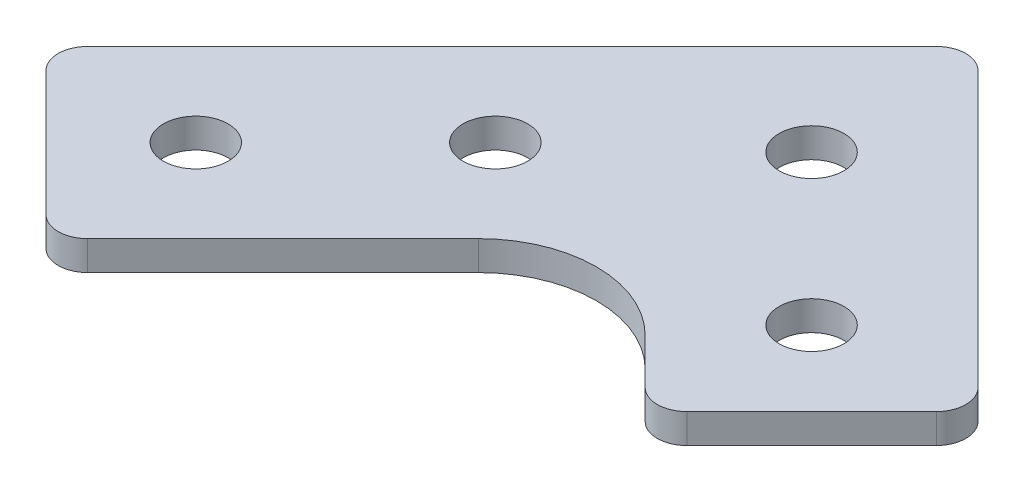
ISO-10303-21;
HEADER;
FILE_DESCRIPTION(('STEP AP214'),'2;1');
FILE_NAME('part.step','',(''),(''),'','','');
FILE_SCHEMA(('AUTOMOTIVE_DESIGN { 1 0 10303 214 1 1 1 1 }'));
ENDSEC;
DATA;
#1=APPLICATION_CONTEXT('core data for automotive mechanical design processes');
#2=APPLICATION_PROTOCOL_DEFINITION('international standard','automotive_design',2000,#1);
#3=PRODUCT_CONTEXT('',#1,'mechanical');
#4=PRODUCT('Part','Part','',(#3));
#5=PRODUCT_RELATED_PRODUCT_CATEGORY('part','',(#4));
#6=PRODUCT_DEFINITION_FORMATION('','',#4);
#7=PRODUCT_DEFINITION_CONTEXT('part definition',#1,'design');
#8=PRODUCT_DEFINITION('design','',#6,#7);
#9=PRODUCT_DEFINITION_SHAPE('','',#8);
#10=(LENGTH_UNIT() NAMED_UNIT(*) SI_UNIT(.MILLI.,.METRE.));
#11=(NAMED_UNIT(*) PLANE_ANGLE_UNIT() SI_UNIT($,.RADIAN.));
#12=(NAMED_UNIT(*) SI_UNIT($,.STERADIAN.) SOLID_ANGLE_UNIT());
#13=UNCERTAINTY_MEASURE_WITH_UNIT(LENGTH_MEASURE(1.E-05),#10,'distance_accuracy_value','');
#14=(GEOMETRIC_REPRESENTATION_CONTEXT(3) GLOBAL_UNCERTAINTY_ASSIGNED_CONTEXT((#13)) GLOBAL_UNIT_ASSIGNED_CONTEXT((#10,
#11,#12)) REPRESENTATION_CONTEXT('',''));
#15=CARTESIAN_POINT('',(0.,0.,0.));
#16=DIRECTION('',(0.,0.,1.));
#17=DIRECTION('',(1.,0.,0.));
#18=AXIS2_PLACEMENT_3D('',#15,#16,#17);
#19=CARTESIAN_POINT('',(32.3289220358488,3.175,32.3289220358491));
#20=DIRECTION('',(-0.70710678118655,0.,0.707106781186545));
#21=DIRECTION('',(0.707106781186545,0.,0.70710678118655));
#22=AXIS2_PLACEMENT_3D('',#19,#20,#21);
#23=PLANE('',#22);
#24=DIRECTION('',(-0.707106781186545,0.,-0.70710678118655));
#25=VECTOR('',#24,1.);
#26=CARTESIAN_POINT('',(32.3289220358488,0.,32.3289220358491));
#27=LINE('',#26,#25);
#28=CARTESIAN_POINT('',(13.9193969876571,0.,13.9193969876572));
#29=VERTEX_POINT('',#28);
#30=CARTESIAN_POINT('',(8.98025612106916,0.,8.98025612106923));
#31=VERTEX_POINT('',#30);
#32=EDGE_CURVE('E137',#29,#31,#27,.T.);
#33=ORIENTED_EDGE('',*,*,#32,.F.);
#34=DIRECTION('',(0.,1.,0.));
#35=VECTOR('',#34,1.);
#36=CARTESIAN_POINT('',(13.9193969876571,3.175,13.9193969876572));
#37=LINE('',#36,#35);
#38=CARTESIAN_POINT('',(13.9193969876571,3.175,13.9193969876572));
#39=VERTEX_POINT('',#38);
#40=EDGE_CURVE('E227',#29,#39,#37,.T.);
#41=ORIENTED_EDGE('',*,*,#40,.T.);
#42=DIRECTION('',(-0.707106781186545,0.,-0.70710678118655));
#43=VECTOR('',#42,1.);
#44=CARTESIAN_POINT('',(32.3289220358488,3.175,32.3289220358491));
#45=LINE('',#44,#43);
#46=CARTESIAN_POINT('',(8.98025612106916,3.175,8.98025612106923));
#47=VERTEX_POINT('',#46);
#48=EDGE_CURVE('E164',#39,#47,#45,.T.);
#49=ORIENTED_EDGE('',*,*,#48,.T.);
#50=DIRECTION('',(0.,-1.,0.));
#51=VECTOR('',#50,1.);
#52=CARTESIAN_POINT('',(8.98025612106917,0.,8.98025612106923));
#53=LINE('',#52,#51);
#54=EDGE_CURVE('E158',#47,#31,#53,.T.);
#55=ORIENTED_EDGE('',*,*,#54,.T.);
#56=EDGE_LOOP('',(#33,#41,#49,#55));
#57=FACE_BOUND('',#56,.T.);
#58=ADVANCED_FACE('F45',(#57),#23,.T.);
#59=CARTESIAN_POINT('',(0.,3.175,-35.9210244842767));
#60=DIRECTION('',(0.707106781186549,0.,-0.707106781186546));
#61=DIRECTION('',(-0.707106781186546,0.,-0.707106781186549));
#62=AXIS2_PLACEMENT_3D('',#59,#60,#61);
#63=PLANE('',#62);
#64=DIRECTION('',(0.707106781186546,0.,0.707106781186549));
#65=VECTOR('',#64,1.);
#66=CARTESIAN_POINT('',(0.,0.,-35.9210244842767));
#67=LINE('',#66,#65);
#68=CARTESIAN_POINT('',(2.2450640302673,0.,-33.6759604540094));
#69=VERTEX_POINT('',#68);
#70=CARTESIAN_POINT('',(31.8799092297955,0.,-4.041115254481));
#71=VERTEX_POINT('',#70);
#72=EDGE_CURVE('E150',#69,#71,#67,.T.);
#73=ORIENTED_EDGE('',*,*,#72,.F.);
#74=DIRECTION('',(0.,-1.,0.));
#75=VECTOR('',#74,1.);
#76=CARTESIAN_POINT('',(2.2450640302673,3.175,-33.6759604540094));
#77=LINE('',#76,#75);
#78=CARTESIAN_POINT('',(2.24506403026731,3.175,-33.6759604540094));
#79=VERTEX_POINT('',#78);
#80=EDGE_CURVE('E204',#69,#79,#77,.F.);
#81=ORIENTED_EDGE('',*,*,#80,.T.);
#82=DIRECTION('',(-0.707106781186545,0.,-0.70710678118655));
#83=VECTOR('',#82,1.);
#84=CARTESIAN_POINT('',(50.2894342779872,3.175,14.3684097937108));
#85=LINE('',#84,#83);
#86=CARTESIAN_POINT('',(31.8799092297955,3.175,-4.04111525448099));
#87=VERTEX_POINT('',#86);
#88=EDGE_CURVE('E167',#87,#79,#85,.T.);
#89=ORIENTED_EDGE('',*,*,#88,.F.);
#90=DIRECTION('',(0.,1.,0.));
#91=VECTOR('',#90,1.);
#92=CARTESIAN_POINT('',(31.8799092297955,3.175,-4.04111525448101));
#93=LINE('',#92,#91);
#94=EDGE_CURVE('E201',#87,#71,#93,.F.);
#95=ORIENTED_EDGE('',*,*,#94,.T.);
#96=EDGE_LOOP('',(#73,#81,#89,#95));
#97=FACE_BOUND('',#96,.T.);
#98=ADVANCED_FACE('F288',(#97),#63,.T.);
#99=CARTESIAN_POINT('',(0.,3.175,0.));
#100=DIRECTION('',(0.,-1.,0.));
#101=DIRECTION('',(0.,0.,-1.));
#102=AXIS2_PLACEMENT_3D('',#99,#100,#101);
#103=PLANE('',#102);
#104=CARTESIAN_POINT('',(-33.2269476479558,3.175,15.2664354058176));
#105=DIRECTION('',(0.,1.,0.));
#106=DIRECTION('',(0.,0.,1.));
#107=AXIS2_PLACEMENT_3D('',#104,#105,#106);
#108=CIRCLE('',#107,3.49250000000001);
#109=CARTESIAN_POINT('',(-33.2269476479558,3.175,18.7589354058176));
#110=VERTEX_POINT('',#109);
#111=EDGE_CURVE('E253',#110,#110,#108,.T.);
#112=ORIENTED_EDGE('',*,*,#111,.F.);
#113=EDGE_LOOP('',(#112));
#114=FACE_BOUND('',#113,.T.);
#115=CARTESIAN_POINT('',(-17.0624866300314,3.175,-0.898025612106886));
#116=DIRECTION('',(0.,1.,0.));
#117=DIRECTION('',(0.,0.,1.));
#118=AXIS2_PLACEMENT_3D('',#115,#116,#117);
#119=CIRCLE('',#118,3.49250000000001);
#120=CARTESIAN_POINT('',(-17.0624866300314,3.175,2.59447438789312));
#121=VERTEX_POINT('',#120);
#122=EDGE_CURVE('E315',#121,#121,#119,.T.);
#123=ORIENTED_EDGE('',*,*,#122,.F.);
#124=EDGE_LOOP('',(#123));
#125=FACE_BOUND('',#124,.T.);
#126=CARTESIAN_POINT('',(0.898025612106959,3.175,-17.0624866300314));
#127=DIRECTION('',(0.,1.,0.));
#128=DIRECTION('',(0.,0.,1.));
#129=AXIS2_PLACEMENT_3D('',#126,#127,#128);
#130=CIRCLE('',#129,3.49250000000001);
#131=CARTESIAN_POINT('',(0.898025612106959,3.175,-13.5699866300313));
#132=VERTEX_POINT('',#131);
#133=EDGE_CURVE('E301',#132,#132,#130,.T.);
#134=ORIENTED_EDGE('',*,*,#133,.F.);
#135=EDGE_LOOP('',(#134));
#136=FACE_BOUND('',#135,.T.);
#137=CARTESIAN_POINT('',(17.0624866300314,3.175,-0.898025612106834));
#138=DIRECTION('',(0.,1.,0.));
#139=DIRECTION('',(0.,0.,1.));
#140=AXIS2_PLACEMENT_3D('',#137,#138,#139);
#141=CIRCLE('',#140,3.49250000000001);
#142=CARTESIAN_POINT('',(17.0624866300314,3.175,2.59447438789317));
#143=VERTEX_POINT('',#142);
#144=EDGE_CURVE('E316',#143,#143,#141,.T.);
#145=ORIENTED_EDGE('',*,*,#144,.F.);
#146=EDGE_LOOP('',(#145));
#147=FACE_BOUND('',#146,.T.);
#148=ORIENTED_EDGE('',*,*,#88,.T.);
#149=CARTESIAN_POINT('',(0.,3.175,-31.4308964237421));
#150=DIRECTION('',(0.,-1.,0.));
#151=DIRECTION('',(0.,0.,-1.));
#152=AXIS2_PLACEMENT_3D('',#149,#150,#151);
#153=CIRCLE('',#152,3.175);
#154=CARTESIAN_POINT('',(-2.24506403026724,3.175,-33.6759604540093));
#155=VERTEX_POINT('',#154);
#156=EDGE_CURVE('E217',#79,#155,#153,.F.);
#157=ORIENTED_EDGE('',*,*,#156,.T.);
#158=DIRECTION('',(-0.707106781186547,0.,0.707106781186548));
#159=VECTOR('',#158,1.);
#160=CARTESIAN_POINT('',(-17.9605122421382,3.175,-17.9605122421383));
#161=LINE('',#160,#159);
#162=CARTESIAN_POINT('',(-48.0443702477199,3.175,12.1233457634434));
#163=VERTEX_POINT('',#162);
#164=EDGE_CURVE('E261',#155,#163,#161,.T.);
#165=ORIENTED_EDGE('',*,*,#164,.T.);
#166=CARTESIAN_POINT('',(-45.7993062174525,3.175,14.3684097937108));
#167=DIRECTION('',(0.,-1.,0.));
#168=DIRECTION('',(0.,0.,-1.));
#169=AXIS2_PLACEMENT_3D('',#166,#167,#168);
#170=CIRCLE('',#169,3.175);
#171=CARTESIAN_POINT('',(-48.0443702477198,3.175,16.6134738239781));
#172=VERTEX_POINT('',#171);
#173=EDGE_CURVE('E209',#163,#172,#170,.F.);
#174=ORIENTED_EDGE('',*,*,#173,.T.);
#175=DIRECTION('',(-0.707106781186548,0.,-0.707106781186547));
#176=VECTOR('',#175,1.);
#177=CARTESIAN_POINT('',(-32.3289220358489,3.175,32.328922035849));
#178=LINE('',#177,#176);
#179=CARTESIAN_POINT('',(-34.5739860661162,3.175,30.0838580055817));
#180=VERTEX_POINT('',#179);
#181=EDGE_CURVE('E242',#180,#172,#178,.T.);
#182=ORIENTED_EDGE('',*,*,#181,.F.);
#183=CARTESIAN_POINT('',(-32.3289220358489,3.175,27.8387939753144));
#184=DIRECTION('',(0.,-1.,0.));
#185=DIRECTION('',(0.,0.,-1.));
#186=AXIS2_PLACEMENT_3D('',#183,#184,#185);
#187=CIRCLE('',#186,3.175);
#188=CARTESIAN_POINT('',(-30.0838580055816,3.175,30.0838580055817));
#189=VERTEX_POINT('',#188);
#190=EDGE_CURVE('E69',#180,#189,#187,.F.);
#191=ORIENTED_EDGE('',*,*,#190,.T.);
#192=DIRECTION('',(-0.707106781186546,0.,0.707106781186549));
#193=VECTOR('',#192,1.);
#194=CARTESIAN_POINT('',(0.,3.175,0.));
#195=LINE('',#194,#193);
#196=CARTESIAN_POINT('',(-8.98025612106919,3.175,8.98025612106921));
#197=VERTEX_POINT('',#196);
#198=EDGE_CURVE('E267',#197,#189,#195,.T.);
#199=ORIENTED_EDGE('',*,*,#198,.F.);
#200=CARTESIAN_POINT('',(0.,3.175,17.9605122421384));
#201=DIRECTION('',(0.,-1.,0.));
#202=DIRECTION('',(0.,0.,-1.));
#203=AXIS2_PLACEMENT_3D('',#200,#201,#202);
#204=CIRCLE('',#203,12.7);
#205=EDGE_CURVE('E161',#197,#47,#204,.T.);
#206=ORIENTED_EDGE('',*,*,#205,.T.);
#207=ORIENTED_EDGE('',*,*,#48,.F.);
#208=CARTESIAN_POINT('',(16.1644610179244,3.175,11.67433295739));
#209=DIRECTION('',(0.,-1.,0.));
#210=DIRECTION('',(0.,0.,-1.));
#211=AXIS2_PLACEMENT_3D('',#208,#209,#210);
#212=CIRCLE('',#211,3.175);
#213=CARTESIAN_POINT('',(18.4095250481917,3.175,13.9193969876573));
#214=VERTEX_POINT('',#213);
#215=EDGE_CURVE('E61',#39,#214,#212,.F.);
#216=ORIENTED_EDGE('',*,*,#215,.T.);
#217=DIRECTION('',(0.70710678118655,0.,-0.707106781186545));
#218=VECTOR('',#217,1.);
#219=CARTESIAN_POINT('',(16.1644610179244,3.175,16.1644610179245));
#220=LINE('',#219,#218);
#221=CARTESIAN_POINT('',(31.8799092297955,3.175,0.449012806053563));
#222=VERTEX_POINT('',#221);
#223=EDGE_CURVE('E302',#214,#222,#220,.T.);
#224=ORIENTED_EDGE('',*,*,#223,.T.);
#225=CARTESIAN_POINT('',(29.6348451995282,3.175,-1.79605122421373));
#226=DIRECTION('',(0.,-1.,0.));
#227=DIRECTION('',(0.,0.,-1.));
#228=AXIS2_PLACEMENT_3D('',#225,#226,#227);
#229=CIRCLE('',#228,3.175);
#230=EDGE_CURVE('E214',#222,#87,#229,.F.);
#231=ORIENTED_EDGE('',*,*,#230,.T.);
#232=EDGE_LOOP('',(#148,#157,#165,#174,#182,#191,#199,#206,#207,#216,#224,#231));
#233=FACE_BOUND('',#232,.T.);
#234=ADVANCED_FACE('F277',(#114,#125,#136,#147,#233),#103,.F.);
#235=CARTESIAN_POINT('',(0.,0.,0.));
#236=DIRECTION('',(0.,-1.,0.));
#237=DIRECTION('',(0.,0.,-1.));
#238=AXIS2_PLACEMENT_3D('',#235,#236,#237);
#239=PLANE('',#238);
#240=CARTESIAN_POINT('',(-33.2269476479558,0.,15.2664354058176));
#241=DIRECTION('',(0.,1.,0.));
#242=DIRECTION('',(0.,0.,1.));
#243=AXIS2_PLACEMENT_3D('',#240,#241,#242);
#244=CIRCLE('',#243,3.49250000000001);
#245=CARTESIAN_POINT('',(-33.2269476479558,0.,18.7589354058176));
#246=VERTEX_POINT('',#245);
#247=EDGE_CURVE('E247',#246,#246,#244,.T.);
#248=ORIENTED_EDGE('',*,*,#247,.T.);
#249=EDGE_LOOP('',(#248));
#250=FACE_BOUND('',#249,.T.);
#251=CARTESIAN_POINT('',(-17.0624866300314,0.,-0.898025612106886));
#252=DIRECTION('',(0.,1.,0.));
#253=DIRECTION('',(0.,0.,1.));
#254=AXIS2_PLACEMENT_3D('',#251,#252,#253);
#255=CIRCLE('',#254,3.49250000000001);
#256=CARTESIAN_POINT('',(-17.0624866300314,0.,2.59447438789312));
#257=VERTEX_POINT('',#256);
#258=EDGE_CURVE('E323',#257,#257,#255,.T.);
#259=ORIENTED_EDGE('',*,*,#258,.T.);
#260=EDGE_LOOP('',(#259));
#261=FACE_BOUND('',#260,.T.);
#262=CARTESIAN_POINT('',(0.898025612106959,0.,-17.0624866300314));
#263=DIRECTION('',(0.,1.,0.));
#264=DIRECTION('',(0.,0.,1.));
#265=AXIS2_PLACEMENT_3D('',#262,#263,#264);
#266=CIRCLE('',#265,3.49250000000001);
#267=CARTESIAN_POINT('',(0.898025612106959,0.,-13.5699866300313));
#268=VERTEX_POINT('',#267);
#269=EDGE_CURVE('E307',#268,#268,#266,.T.);
#270=ORIENTED_EDGE('',*,*,#269,.T.);
#271=EDGE_LOOP('',(#270));
#272=FACE_BOUND('',#271,.T.);
#273=CARTESIAN_POINT('',(17.0624866300314,0.,-0.898025612106834));
#274=DIRECTION('',(0.,1.,0.));
#275=DIRECTION('',(0.,0.,1.));
#276=AXIS2_PLACEMENT_3D('',#273,#274,#275);
#277=CIRCLE('',#276,3.49250000000001);
#278=CARTESIAN_POINT('',(17.0624866300314,0.,2.59447438789317));
#279=VERTEX_POINT('',#278);
#280=EDGE_CURVE('E311',#279,#279,#277,.T.);
#281=ORIENTED_EDGE('',*,*,#280,.T.);
#282=EDGE_LOOP('',(#281));
#283=FACE_BOUND('',#282,.T.);
#284=DIRECTION('',(0.707106781186545,0.,-0.70710678118655));
#285=VECTOR('',#284,1.);
#286=CARTESIAN_POINT('',(-17.9605122421382,0.,-17.9605122421383));
#287=LINE('',#286,#285);
#288=CARTESIAN_POINT('',(-48.0443702477198,0.,12.1233457634435));
#289=VERTEX_POINT('',#288);
#290=CARTESIAN_POINT('',(-2.24506403026729,0.,-33.6759604540094));
#291=VERTEX_POINT('',#290);
#292=EDGE_CURVE('E175',#289,#291,#287,.T.);
#293=ORIENTED_EDGE('',*,*,#292,.T.);
#294=CARTESIAN_POINT('',(0.,0.,-31.4308964237421));
#295=DIRECTION('',(0.,-1.,0.));
#296=DIRECTION('',(0.,0.,-1.));
#297=AXIS2_PLACEMENT_3D('',#294,#295,#296);
#298=CIRCLE('',#297,3.175);
#299=EDGE_CURVE('E198',#291,#69,#298,.T.);
#300=ORIENTED_EDGE('',*,*,#299,.T.);
#301=ORIENTED_EDGE('',*,*,#72,.T.);
#302=CARTESIAN_POINT('',(29.6348451995282,0.,-1.79605122421373));
#303=DIRECTION('',(0.,-1.,0.));
#304=DIRECTION('',(0.,0.,-1.));
#305=AXIS2_PLACEMENT_3D('',#302,#303,#304);
#306=CIRCLE('',#305,3.175);
#307=CARTESIAN_POINT('',(31.8799092297955,0.,0.449012806053563));
#308=VERTEX_POINT('',#307);
#309=EDGE_CURVE('E195',#71,#308,#306,.T.);
#310=ORIENTED_EDGE('',*,*,#309,.T.);
#311=DIRECTION('',(0.70710678118655,0.,-0.707106781186545));
#312=VECTOR('',#311,1.);
#313=CARTESIAN_POINT('',(16.1644610179244,0.,16.1644610179245));
#314=LINE('',#313,#312);
#315=CARTESIAN_POINT('',(18.4095250481917,0.,13.9193969876573));
#316=VERTEX_POINT('',#315);
#317=EDGE_CURVE('E295',#316,#308,#314,.T.);
#318=ORIENTED_EDGE('',*,*,#317,.F.);
#319=CARTESIAN_POINT('',(16.1644610179244,0.,11.67433295739));
#320=DIRECTION('',(0.,-1.,0.));
#321=DIRECTION('',(0.,0.,-1.));
#322=AXIS2_PLACEMENT_3D('',#319,#320,#321);
#323=CIRCLE('',#322,3.175);
#324=EDGE_CURVE('E146',#316,#29,#323,.T.);
#325=ORIENTED_EDGE('',*,*,#324,.T.);
#326=ORIENTED_EDGE('',*,*,#32,.T.);
#327=CARTESIAN_POINT('',(0.,0.,17.9605122421384));
#328=DIRECTION('',(0.,-1.,0.));
#329=DIRECTION('',(0.,0.,-1.));
#330=AXIS2_PLACEMENT_3D('',#327,#328,#329);
#331=CIRCLE('',#330,12.7);
#332=CARTESIAN_POINT('',(-8.98025612106919,0.,8.98025612106921));
#333=VERTEX_POINT('',#332);
#334=EDGE_CURVE('E142',#31,#333,#331,.F.);
#335=ORIENTED_EDGE('',*,*,#334,.T.);
#336=DIRECTION('',(-0.707106781186546,0.,0.707106781186549));
#337=VECTOR('',#336,1.);
#338=CARTESIAN_POINT('',(0.,0.,0.));
#339=LINE('',#338,#337);
#340=CARTESIAN_POINT('',(-30.0838580055816,0.,30.0838580055817));
#341=VERTEX_POINT('',#340);
#342=EDGE_CURVE('E151',#333,#341,#339,.T.);
#343=ORIENTED_EDGE('',*,*,#342,.T.);
#344=CARTESIAN_POINT('',(-32.3289220358489,0.,27.8387939753144));
#345=DIRECTION('',(0.,-1.,0.));
#346=DIRECTION('',(0.,0.,-1.));
#347=AXIS2_PLACEMENT_3D('',#344,#345,#346);
#348=CIRCLE('',#347,3.175);
#349=CARTESIAN_POINT('',(-34.5739860661162,0.,30.0838580055817));
#350=VERTEX_POINT('',#349);
#351=EDGE_CURVE('E187',#341,#350,#348,.T.);
#352=ORIENTED_EDGE('',*,*,#351,.T.);
#353=DIRECTION('',(-0.707106781186548,0.,-0.707106781186547));
#354=VECTOR('',#353,1.);
#355=CARTESIAN_POINT('',(-32.3289220358489,0.,32.328922035849));
#356=LINE('',#355,#354);
#357=CARTESIAN_POINT('',(-48.0443702477198,0.,16.6134738239781));
#358=VERTEX_POINT('',#357);
#359=EDGE_CURVE('E240',#350,#358,#356,.T.);
#360=ORIENTED_EDGE('',*,*,#359,.T.);
#361=CARTESIAN_POINT('',(-45.7993062174525,0.,14.3684097937108));
#362=DIRECTION('',(0.,-1.,0.));
#363=DIRECTION('',(0.,0.,-1.));
#364=AXIS2_PLACEMENT_3D('',#361,#362,#363);
#365=CIRCLE('',#364,3.175);
#366=EDGE_CURVE('E190',#358,#289,#365,.T.);
#367=ORIENTED_EDGE('',*,*,#366,.T.);
#368=EDGE_LOOP('',(#293,#300,#301,#310,#318,#325,#326,#335,#343,#352,#360,#367));
#369=FACE_BOUND('',#368,.T.);
#370=ADVANCED_FACE('F140',(#250,#261,#272,#283,#369),#239,.T.);
#371=CARTESIAN_POINT('',(-32.3289220358489,3.175,32.328922035849));
#372=DIRECTION('',(-0.707106781186547,0.,0.707106781186548));
#373=DIRECTION('',(0.707106781186548,0.,0.707106781186547));
#374=AXIS2_PLACEMENT_3D('',#371,#372,#373);
#375=PLANE('',#374);
#376=ORIENTED_EDGE('',*,*,#181,.T.);
#377=DIRECTION('',(0.,-1.,0.));
#378=VECTOR('',#377,1.);
#379=CARTESIAN_POINT('',(-48.0443702477198,3.175,16.6134738239781));
#380=LINE('',#379,#378);
#381=EDGE_CURVE('E54',#172,#358,#380,.T.);
#382=ORIENTED_EDGE('',*,*,#381,.T.);
#383=ORIENTED_EDGE('',*,*,#359,.F.);
#384=DIRECTION('',(0.,-1.,0.));
#385=VECTOR('',#384,1.);
#386=CARTESIAN_POINT('',(-34.5739860661162,3.175,30.0838580055817));
#387=LINE('',#386,#385);
#388=EDGE_CURVE('E230',#350,#180,#387,.F.);
#389=ORIENTED_EDGE('',*,*,#388,.T.);
#390=EDGE_LOOP('',(#376,#382,#383,#389));
#391=FACE_BOUND('',#390,.T.);
#392=ADVANCED_FACE('F239',(#391),#375,.T.);
#393=CARTESIAN_POINT('',(0.,3.175,0.));
#394=DIRECTION('',(0.707106781186549,0.,0.707106781186546));
#395=DIRECTION('',(0.707106781186546,0.,-0.707106781186549));
#396=AXIS2_PLACEMENT_3D('',#393,#394,#395);
#397=PLANE('',#396);
#398=ORIENTED_EDGE('',*,*,#198,.T.);
#399=DIRECTION('',(0.,-1.,0.));
#400=VECTOR('',#399,1.);
#401=CARTESIAN_POINT('',(-30.0838580055816,3.175,30.0838580055817));
#402=LINE('',#401,#400);
#403=EDGE_CURVE('E11',#189,#341,#402,.T.);
#404=ORIENTED_EDGE('',*,*,#403,.T.);
#405=ORIENTED_EDGE('',*,*,#342,.F.);
#406=DIRECTION('',(0.,-1.,0.));
#407=VECTOR('',#406,1.);
#408=CARTESIAN_POINT('',(-8.98025612106919,3.175,8.98025612106921));
#409=LINE('',#408,#407);
#410=EDGE_CURVE('E159',#333,#197,#409,.F.);
#411=ORIENTED_EDGE('',*,*,#410,.T.);
#412=EDGE_LOOP('',(#398,#404,#405,#411));
#413=FACE_BOUND('',#412,.T.);
#414=ADVANCED_FACE('F275',(#413),#397,.T.);
#415=CARTESIAN_POINT('',(-17.9605122421382,3.175,-17.9605122421383));
#416=DIRECTION('',(-0.70710678118655,0.,-0.707106781186545));
#417=DIRECTION('',(-0.707106781186545,0.,0.70710678118655));
#418=AXIS2_PLACEMENT_3D('',#415,#416,#417);
#419=PLANE('',#418);
#420=ORIENTED_EDGE('',*,*,#164,.F.);
#421=DIRECTION('',(0.,-1.,0.));
#422=VECTOR('',#421,1.);
#423=CARTESIAN_POINT('',(-2.24506403026729,3.175,-33.6759604540093));
#424=LINE('',#423,#422);
#425=EDGE_CURVE('E183',#155,#291,#424,.T.);
#426=ORIENTED_EDGE('',*,*,#425,.T.);
#427=ORIENTED_EDGE('',*,*,#292,.F.);
#428=DIRECTION('',(0.,-1.,0.));
#429=VECTOR('',#428,1.);
#430=CARTESIAN_POINT('',(-48.0443702477198,3.175,12.1233457634435));
#431=LINE('',#430,#429);
#432=EDGE_CURVE('E180',#289,#163,#431,.F.);
#433=ORIENTED_EDGE('',*,*,#432,.T.);
#434=EDGE_LOOP('',(#420,#426,#427,#433));
#435=FACE_BOUND('',#434,.T.);
#436=ADVANCED_FACE('F281',(#435),#419,.T.);
#437=CARTESIAN_POINT('',(-33.2269476479558,0.,15.2664354058176));
#438=DIRECTION('',(0.,1.,0.));
#439=DIRECTION('',(0.,0.,1.));
#440=AXIS2_PLACEMENT_3D('',#437,#438,#439);
#441=CYLINDRICAL_SURFACE('',#440,3.49250000000001);
#442=ORIENTED_EDGE('',*,*,#247,.F.);
#443=EDGE_LOOP('',(#442));
#444=FACE_BOUND('',#443,.T.);
#445=ORIENTED_EDGE('',*,*,#111,.T.);
#446=EDGE_LOOP('',(#445));
#447=FACE_BOUND('',#446,.T.);
#448=ADVANCED_FACE('F425',(#444,#447),#441,.F.);
#449=CARTESIAN_POINT('',(-17.0624866300314,0.,-0.898025612106886));
#450=DIRECTION('',(0.,1.,0.));
#451=DIRECTION('',(0.,0.,1.));
#452=AXIS2_PLACEMENT_3D('',#449,#450,#451);
#453=CYLINDRICAL_SURFACE('',#452,3.49250000000001);
#454=ORIENTED_EDGE('',*,*,#258,.F.);
#455=EDGE_LOOP('',(#454));
#456=FACE_BOUND('',#455,.T.);
#457=ORIENTED_EDGE('',*,*,#122,.T.);
#458=EDGE_LOOP('',(#457));
#459=FACE_BOUND('',#458,.T.);
#460=ADVANCED_FACE('F331',(#456,#459),#453,.F.);
#461=CARTESIAN_POINT('',(0.898025612106959,0.,-17.0624866300314));
#462=DIRECTION('',(0.,1.,0.));
#463=DIRECTION('',(0.,0.,1.));
#464=AXIS2_PLACEMENT_3D('',#461,#462,#463);
#465=CYLINDRICAL_SURFACE('',#464,3.49250000000001);
#466=ORIENTED_EDGE('',*,*,#269,.F.);
#467=EDGE_LOOP('',(#466));
#468=FACE_BOUND('',#467,.T.);
#469=ORIENTED_EDGE('',*,*,#133,.T.);
#470=EDGE_LOOP('',(#469));
#471=FACE_BOUND('',#470,.T.);
#472=ADVANCED_FACE('F343',(#468,#471),#465,.F.);
#473=CARTESIAN_POINT('',(17.0624866300314,0.,-0.898025612106834));
#474=DIRECTION('',(0.,1.,0.));
#475=DIRECTION('',(0.,0.,1.));
#476=AXIS2_PLACEMENT_3D('',#473,#474,#475);
#477=CYLINDRICAL_SURFACE('',#476,3.49250000000001);
#478=ORIENTED_EDGE('',*,*,#280,.F.);
#479=EDGE_LOOP('',(#478));
#480=FACE_BOUND('',#479,.T.);
#481=ORIENTED_EDGE('',*,*,#144,.T.);
#482=EDGE_LOOP('',(#481));
#483=FACE_BOUND('',#482,.T.);
#484=ADVANCED_FACE('F341',(#480,#483),#477,.F.);
#485=CARTESIAN_POINT('',(16.1644610179244,0.,16.1644610179245));
#486=DIRECTION('',(0.707106781186545,0.,0.70710678118655));
#487=DIRECTION('',(0.70710678118655,0.,-0.707106781186545));
#488=AXIS2_PLACEMENT_3D('',#485,#486,#487);
#489=PLANE('',#488);
#490=ORIENTED_EDGE('',*,*,#317,.T.);
#491=DIRECTION('',(0.,1.,0.));
#492=VECTOR('',#491,1.);
#493=CARTESIAN_POINT('',(31.8799092297955,0.,0.449012806053563));
#494=LINE('',#493,#492);
#495=EDGE_CURVE('E223',#308,#222,#494,.T.);
#496=ORIENTED_EDGE('',*,*,#495,.T.);
#497=ORIENTED_EDGE('',*,*,#223,.F.);
#498=DIRECTION('',(0.,1.,0.));
#499=VECTOR('',#498,1.);
#500=CARTESIAN_POINT('',(18.4095250481917,0.,13.9193969876573));
#501=LINE('',#500,#499);
#502=EDGE_CURVE('E220',#214,#316,#501,.F.);
#503=ORIENTED_EDGE('',*,*,#502,.T.);
#504=EDGE_LOOP('',(#490,#496,#497,#503));
#505=FACE_BOUND('',#504,.T.);
#506=ADVANCED_FACE('F297',(#505),#489,.T.);
#507=CARTESIAN_POINT('',(0.,3.175,17.9605122421384));
#508=DIRECTION('',(0.,1.,0.));
#509=DIRECTION('',(0.,0.,1.));
#510=AXIS2_PLACEMENT_3D('',#507,#508,#509);
#511=CYLINDRICAL_SURFACE('',#510,12.7);
#512=ORIENTED_EDGE('',*,*,#205,.F.);
#513=ORIENTED_EDGE('',*,*,#410,.F.);
#514=ORIENTED_EDGE('',*,*,#334,.F.);
#515=ORIENTED_EDGE('',*,*,#54,.F.);
#516=EDGE_LOOP('',(#512,#513,#514,#515));
#517=FACE_BOUND('',#516,.T.);
#518=ADVANCED_FACE('F157',(#517),#511,.F.);
#519=CARTESIAN_POINT('',(0.,3.175,-31.4308964237421));
#520=DIRECTION('',(0.,-1.,0.));
#521=DIRECTION('',(0.,0.,-1.));
#522=AXIS2_PLACEMENT_3D('',#519,#520,#521);
#523=CYLINDRICAL_SURFACE('',#522,3.175);
#524=ORIENTED_EDGE('',*,*,#156,.F.);
#525=ORIENTED_EDGE('',*,*,#80,.F.);
#526=ORIENTED_EDGE('',*,*,#299,.F.);
#527=ORIENTED_EDGE('',*,*,#425,.F.);
#528=EDGE_LOOP('',(#524,#525,#526,#527));
#529=FACE_BOUND('',#528,.T.);
#530=ADVANCED_FACE('F285',(#529),#523,.T.);
#531=CARTESIAN_POINT('',(29.6348451995282,0.,-1.79605122421373));
#532=DIRECTION('',(0.,1.,0.));
#533=DIRECTION('',(0.,0.,1.));
#534=AXIS2_PLACEMENT_3D('',#531,#532,#533);
#535=CYLINDRICAL_SURFACE('',#534,3.175);
#536=ORIENTED_EDGE('',*,*,#309,.F.);
#537=ORIENTED_EDGE('',*,*,#94,.F.);
#538=ORIENTED_EDGE('',*,*,#230,.F.);
#539=ORIENTED_EDGE('',*,*,#495,.F.);
#540=EDGE_LOOP('',(#536,#537,#538,#539));
#541=FACE_BOUND('',#540,.T.);
#542=ADVANCED_FACE('F292',(#541),#535,.T.);
#543=CARTESIAN_POINT('',(16.1644610179244,3.175,11.67433295739));
#544=DIRECTION('',(0.,1.,0.));
#545=DIRECTION('',(0.,0.,1.));
#546=AXIS2_PLACEMENT_3D('',#543,#544,#545);
#547=CYLINDRICAL_SURFACE('',#546,3.175);
#548=ORIENTED_EDGE('',*,*,#324,.F.);
#549=ORIENTED_EDGE('',*,*,#502,.F.);
#550=ORIENTED_EDGE('',*,*,#215,.F.);
#551=ORIENTED_EDGE('',*,*,#40,.F.);
#552=EDGE_LOOP('',(#548,#549,#550,#551));
#553=FACE_BOUND('',#552,.T.);
#554=ADVANCED_FACE('F372',(#553),#547,.T.);
#555=CARTESIAN_POINT('',(-45.7993062174525,3.175,14.3684097937108));
#556=DIRECTION('',(0.,-1.,0.));
#557=DIRECTION('',(0.,0.,-1.));
#558=AXIS2_PLACEMENT_3D('',#555,#556,#557);
#559=CYLINDRICAL_SURFACE('',#558,3.175);
#560=ORIENTED_EDGE('',*,*,#173,.F.);
#561=ORIENTED_EDGE('',*,*,#432,.F.);
#562=ORIENTED_EDGE('',*,*,#366,.F.);
#563=ORIENTED_EDGE('',*,*,#381,.F.);
#564=EDGE_LOOP('',(#560,#561,#562,#563));
#565=FACE_BOUND('',#564,.T.);
#566=ADVANCED_FACE('F279',(#565),#559,.T.);
#567=CARTESIAN_POINT('',(-32.3289220358489,3.175,27.8387939753144));
#568=DIRECTION('',(0.,-1.,0.));
#569=DIRECTION('',(0.,0.,-1.));
#570=AXIS2_PLACEMENT_3D('',#567,#568,#569);
#571=CYLINDRICAL_SURFACE('',#570,3.175);
#572=ORIENTED_EDGE('',*,*,#190,.F.);
#573=ORIENTED_EDGE('',*,*,#388,.F.);
#574=ORIENTED_EDGE('',*,*,#351,.F.);
#575=ORIENTED_EDGE('',*,*,#403,.F.);
#576=EDGE_LOOP('',(#572,#573,#574,#575));
#577=FACE_BOUND('',#576,.T.);
#578=ADVANCED_FACE('F47',(#577),#571,.T.);
#579=CLOSED_SHELL('',(#58,#98,#234,#370,#392,#414,#436,#448,#460,#472,#484,#506,#518,#530,#542,
#554,#566,#578));
#580=MANIFOLD_SOLID_BREP('B2',#579);
#581=ADVANCED_BREP_SHAPE_REPRESENTATION('',(#18,#580),#14);
#582=SHAPE_DEFINITION_REPRESENTATION(#9,#581);
ENDSEC;
END-ISO-10303-21;
